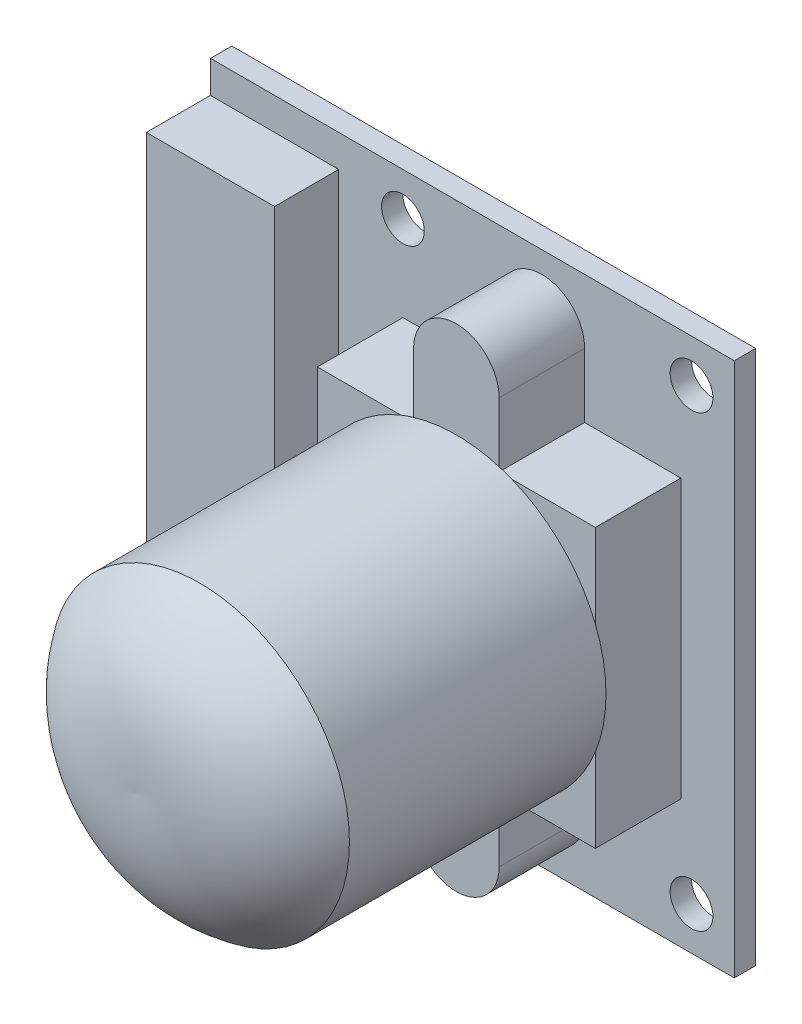
ISO-10303-21;
HEADER;
FILE_DESCRIPTION(('STEP AP214'),'2;1');
FILE_NAME('part.step','',(''),(''),'','','');
FILE_SCHEMA(('AUTOMOTIVE_DESIGN { 1 0 10303 214 1 1 1 1 }'));
ENDSEC;
DATA;
#1=APPLICATION_CONTEXT('core data for automotive mechanical design processes');
#2=APPLICATION_PROTOCOL_DEFINITION('international standard','automotive_design',2000,#1);
#3=PRODUCT_CONTEXT('',#1,'mechanical');
#4=PRODUCT('Part','Part','',(#3));
#5=PRODUCT_RELATED_PRODUCT_CATEGORY('part','',(#4));
#6=PRODUCT_DEFINITION_FORMATION('','',#4);
#7=PRODUCT_DEFINITION_CONTEXT('part definition',#1,'design');
#8=PRODUCT_DEFINITION('design','',#6,#7);
#9=PRODUCT_DEFINITION_SHAPE('','',#8);
#10=(LENGTH_UNIT() NAMED_UNIT(*) SI_UNIT(.MILLI.,.METRE.));
#11=(NAMED_UNIT(*) PLANE_ANGLE_UNIT() SI_UNIT($,.RADIAN.));
#12=(NAMED_UNIT(*) SI_UNIT($,.STERADIAN.) SOLID_ANGLE_UNIT());
#13=UNCERTAINTY_MEASURE_WITH_UNIT(LENGTH_MEASURE(1.E-05),#10,'distance_accuracy_value','');
#14=(GEOMETRIC_REPRESENTATION_CONTEXT(3) GLOBAL_UNCERTAINTY_ASSIGNED_CONTEXT((#13)) GLOBAL_UNIT_ASSIGNED_CONTEXT((#10,
#11,#12)) REPRESENTATION_CONTEXT('',''));
#15=CARTESIAN_POINT('',(0.,0.,0.));
#16=DIRECTION('',(0.,0.,1.));
#17=DIRECTION('',(1.,0.,0.));
#18=AXIS2_PLACEMENT_3D('',#15,#16,#17);
#19=CARTESIAN_POINT('',(0.,0.,5.));
#20=DIRECTION('',(0.,0.,1.));
#21=DIRECTION('',(1.,0.,0.));
#22=AXIS2_PLACEMENT_3D('',#19,#20,#21);
#23=PLANE('',#22);
#24=CARTESIAN_POINT('',(3.25,0.,5.));
#25=DIRECTION('',(0.,0.,1.));
#26=DIRECTION('',(1.,0.,0.));
#27=AXIS2_PLACEMENT_3D('',#24,#25,#26);
#28=CIRCLE('',#27,7.);
#29=CARTESIAN_POINT('',(9.75,2.59807621135332,5.));
#30=VERTEX_POINT('',#29);
#31=CARTESIAN_POINT('',(5.84807621135332,6.5,5.));
#32=VERTEX_POINT('',#31);
#33=EDGE_CURVE('E223',#30,#32,#28,.T.);
#34=ORIENTED_EDGE('',*,*,#33,.F.);
#35=DIRECTION('',(0.,-1.,0.));
#36=VECTOR('',#35,1.);
#37=CARTESIAN_POINT('',(9.75,0.,5.));
#38=LINE('',#37,#36);
#39=CARTESIAN_POINT('',(9.75,6.5,5.));
#40=VERTEX_POINT('',#39);
#41=EDGE_CURVE('E270',#40,#30,#38,.T.);
#42=ORIENTED_EDGE('',*,*,#41,.F.);
#43=DIRECTION('',(1.,0.,0.));
#44=VECTOR('',#43,1.);
#45=CARTESIAN_POINT('',(0.,6.5,5.));
#46=LINE('',#45,#44);
#47=EDGE_CURVE('E60',#32,#40,#46,.T.);
#48=ORIENTED_EDGE('',*,*,#47,.F.);
#49=EDGE_LOOP('',(#34,#42,#48));
#50=FACE_BOUND('',#49,.T.);
#51=ADVANCED_FACE('F36',(#50),#23,.T.);
#52=CARTESIAN_POINT('',(5.25000000000001,6.70820393249937,5.));
#53=VERTEX_POINT('',#52);
#54=CARTESIAN_POINT('',(1.25000000000001,6.70820393249937,5.));
#55=VERTEX_POINT('',#54);
#56=EDGE_CURVE('E11',#53,#55,#28,.T.);
#57=ORIENTED_EDGE('',*,*,#56,.F.);
#58=DIRECTION('',(0.,-1.,0.));
#59=VECTOR('',#58,1.);
#60=CARTESIAN_POINT('',(5.25000000000001,0.,5.));
#61=LINE('',#60,#59);
#62=CARTESIAN_POINT('',(5.25000000000001,9.5,5.));
#63=VERTEX_POINT('',#62);
#64=EDGE_CURVE('E275',#63,#53,#61,.T.);
#65=ORIENTED_EDGE('',*,*,#64,.F.);
#66=CARTESIAN_POINT('',(3.25000000000001,9.5,5.));
#67=DIRECTION('',(0.,0.,1.));
#68=DIRECTION('',(1.,0.,0.));
#69=AXIS2_PLACEMENT_3D('',#66,#67,#68);
#70=CIRCLE('',#69,2.);
#71=CARTESIAN_POINT('',(1.25000000000001,9.5,5.));
#72=VERTEX_POINT('',#71);
#73=EDGE_CURVE('E236',#63,#72,#70,.T.);
#74=ORIENTED_EDGE('',*,*,#73,.T.);
#75=DIRECTION('',(0.,-1.,0.));
#76=VECTOR('',#75,1.);
#77=CARTESIAN_POINT('',(1.25000000000001,0.,5.));
#78=LINE('',#77,#76);
#79=EDGE_CURVE('E241',#72,#55,#78,.T.);
#80=ORIENTED_EDGE('',*,*,#79,.T.);
#81=EDGE_LOOP('',(#57,#65,#74,#80));
#82=FACE_BOUND('',#81,.T.);
#83=ADVANCED_FACE('F518',(#82),#23,.T.);
#84=CARTESIAN_POINT('',(0.651923788646684,6.5,5.));
#85=VERTEX_POINT('',#84);
#86=CARTESIAN_POINT('',(-3.25,2.59807621135331,5.));
#87=VERTEX_POINT('',#86);
#88=EDGE_CURVE('E45',#85,#87,#28,.T.);
#89=ORIENTED_EDGE('',*,*,#88,.F.);
#90=CARTESIAN_POINT('',(-3.25,6.5,5.));
#91=VERTEX_POINT('',#90);
#92=EDGE_CURVE('E244',#91,#85,#46,.T.);
#93=ORIENTED_EDGE('',*,*,#92,.F.);
#94=DIRECTION('',(0.,-1.,0.));
#95=VECTOR('',#94,1.);
#96=CARTESIAN_POINT('',(-3.25,0.,5.));
#97=LINE('',#96,#95);
#98=EDGE_CURVE('E249',#91,#87,#97,.T.);
#99=ORIENTED_EDGE('',*,*,#98,.T.);
#100=EDGE_LOOP('',(#89,#93,#99));
#101=FACE_BOUND('',#100,.T.);
#102=ADVANCED_FACE('F436',(#101),#23,.T.);
#103=CARTESIAN_POINT('',(-3.25,-2.59807621135332,5.));
#104=VERTEX_POINT('',#103);
#105=CARTESIAN_POINT('',(0.651923788646683,-6.5,5.));
#106=VERTEX_POINT('',#105);
#107=EDGE_CURVE('E423',#104,#106,#28,.T.);
#108=ORIENTED_EDGE('',*,*,#107,.F.);
#109=CARTESIAN_POINT('',(-3.25,-6.5,5.));
#110=VERTEX_POINT('',#109);
#111=EDGE_CURVE('E247',#104,#110,#97,.T.);
#112=ORIENTED_EDGE('',*,*,#111,.T.);
#113=DIRECTION('',(1.,0.,0.));
#114=VECTOR('',#113,1.);
#115=CARTESIAN_POINT('',(0.,-6.5,5.));
#116=LINE('',#115,#114);
#117=EDGE_CURVE('E254',#110,#106,#116,.T.);
#118=ORIENTED_EDGE('',*,*,#117,.T.);
#119=EDGE_LOOP('',(#108,#112,#118));
#120=FACE_BOUND('',#119,.T.);
#121=ADVANCED_FACE('F533',(#120),#23,.T.);
#122=CARTESIAN_POINT('',(1.25000000000001,-6.70820393249937,5.));
#123=VERTEX_POINT('',#122);
#124=CARTESIAN_POINT('',(5.25000000000001,-6.70820393249937,5.));
#125=VERTEX_POINT('',#124);
#126=EDGE_CURVE('E418',#123,#125,#28,.T.);
#127=ORIENTED_EDGE('',*,*,#126,.F.);
#128=DIRECTION('',(0.,1.,0.));
#129=VECTOR('',#128,1.);
#130=CARTESIAN_POINT('',(1.25000000000001,0.,5.));
#131=LINE('',#130,#129);
#132=CARTESIAN_POINT('',(1.25000000000001,-9.5,5.));
#133=VERTEX_POINT('',#132);
#134=EDGE_CURVE('E260',#133,#123,#131,.T.);
#135=ORIENTED_EDGE('',*,*,#134,.F.);
#136=CARTESIAN_POINT('',(3.25000000000001,-9.5,5.));
#137=DIRECTION('',(0.,0.,1.));
#138=DIRECTION('',(1.,0.,0.));
#139=AXIS2_PLACEMENT_3D('',#136,#137,#138);
#140=CIRCLE('',#139,2.);
#141=CARTESIAN_POINT('',(5.25000000000001,-9.49999999999999,5.));
#142=VERTEX_POINT('',#141);
#143=EDGE_CURVE('E263',#142,#133,#140,.F.);
#144=ORIENTED_EDGE('',*,*,#143,.F.);
#145=DIRECTION('',(0.,1.,0.));
#146=VECTOR('',#145,1.);
#147=CARTESIAN_POINT('',(5.25000000000001,0.,5.));
#148=LINE('',#147,#146);
#149=EDGE_CURVE('E267',#142,#125,#148,.T.);
#150=ORIENTED_EDGE('',*,*,#149,.T.);
#151=EDGE_LOOP('',(#127,#135,#144,#150));
#152=FACE_BOUND('',#151,.T.);
#153=ADVANCED_FACE('F487',(#152),#23,.T.);
#154=CARTESIAN_POINT('',(0.,0.,1.));
#155=DIRECTION('',(0.,0.,-1.));
#156=DIRECTION('',(-1.,0.,0.));
#157=AXIS2_PLACEMENT_3D('',#154,#155,#156);
#158=PLANE('',#157);
#159=DIRECTION('',(1.,0.,0.));
#160=VECTOR('',#159,1.);
#161=CARTESIAN_POINT('',(0.,-11.,1.));
#162=LINE('',#161,#160);
#163=CARTESIAN_POINT('',(-12.25,-11.,1.));
#164=VERTEX_POINT('',#163);
#165=CARTESIAN_POINT('',(-6.25,-11.,1.));
#166=VERTEX_POINT('',#165);
#167=EDGE_CURVE('E352',#164,#166,#162,.T.);
#168=ORIENTED_EDGE('',*,*,#167,.F.);
#169=DIRECTION('',(0.,-1.,0.));
#170=VECTOR('',#169,1.);
#171=CARTESIAN_POINT('',(-12.25,-12.5,1.));
#172=LINE('',#171,#170);
#173=CARTESIAN_POINT('',(-12.25,-12.5,1.));
#174=VERTEX_POINT('',#173);
#175=EDGE_CURVE('E391',#164,#174,#172,.T.);
#176=ORIENTED_EDGE('',*,*,#175,.T.);
#177=DIRECTION('',(1.,0.,0.));
#178=VECTOR('',#177,1.);
#179=CARTESIAN_POINT('',(-12.25,-12.5,1.));
#180=LINE('',#179,#178);
#181=CARTESIAN_POINT('',(12.25,-12.5,1.));
#182=VERTEX_POINT('',#181);
#183=EDGE_CURVE('E394',#174,#182,#180,.T.);
#184=ORIENTED_EDGE('',*,*,#183,.T.);
#185=DIRECTION('',(0.,1.,0.));
#186=VECTOR('',#185,1.);
#187=CARTESIAN_POINT('',(12.25,-12.5,1.));
#188=LINE('',#187,#186);
#189=CARTESIAN_POINT('',(12.25,12.5,1.));
#190=VERTEX_POINT('',#189);
#191=EDGE_CURVE('E385',#182,#190,#188,.T.);
#192=ORIENTED_EDGE('',*,*,#191,.T.);
#193=DIRECTION('',(-1.,0.,0.));
#194=VECTOR('',#193,1.);
#195=CARTESIAN_POINT('',(-12.25,12.5,1.));
#196=LINE('',#195,#194);
#197=CARTESIAN_POINT('',(-12.25,12.5,1.));
#198=VERTEX_POINT('',#197);
#199=EDGE_CURVE('E388',#190,#198,#196,.T.);
#200=ORIENTED_EDGE('',*,*,#199,.T.);
#201=CARTESIAN_POINT('',(-12.25,11.,1.));
#202=VERTEX_POINT('',#201);
#203=EDGE_CURVE('E392',#198,#202,#172,.T.);
#204=ORIENTED_EDGE('',*,*,#203,.T.);
#205=DIRECTION('',(1.,0.,0.));
#206=VECTOR('',#205,1.);
#207=CARTESIAN_POINT('',(0.,11.,1.));
#208=LINE('',#207,#206);
#209=CARTESIAN_POINT('',(-6.25,11.,1.));
#210=VERTEX_POINT('',#209);
#211=EDGE_CURVE('E359',#202,#210,#208,.T.);
#212=ORIENTED_EDGE('',*,*,#211,.T.);
#213=DIRECTION('',(0.,1.,0.));
#214=VECTOR('',#213,1.);
#215=CARTESIAN_POINT('',(-6.25,0.,1.));
#216=LINE('',#215,#214);
#217=EDGE_CURVE('E369',#166,#210,#216,.T.);
#218=ORIENTED_EDGE('',*,*,#217,.F.);
#219=EDGE_LOOP('',(#168,#176,#184,#192,#200,#204,#212,#218));
#220=FACE_BOUND('',#219,.T.);
#221=CARTESIAN_POINT('',(10.25,10.5,1.));
#222=DIRECTION('',(0.,0.,1.));
#223=DIRECTION('',(1.,0.,0.));
#224=AXIS2_PLACEMENT_3D('',#221,#222,#223);
#225=CIRCLE('',#224,1.);
#226=CARTESIAN_POINT('',(11.25,10.5,1.));
#227=VERTEX_POINT('',#226);
#228=EDGE_CURVE('E334',#227,#227,#225,.T.);
#229=ORIENTED_EDGE('',*,*,#228,.F.);
#230=EDGE_LOOP('',(#229));
#231=FACE_BOUND('',#230,.T.);
#232=CARTESIAN_POINT('',(10.25,-10.5,1.));
#233=DIRECTION('',(0.,0.,1.));
#234=DIRECTION('',(1.,0.,0.));
#235=AXIS2_PLACEMENT_3D('',#232,#233,#234);
#236=CIRCLE('',#235,1.);
#237=CARTESIAN_POINT('',(11.25,-10.5,1.));
#238=VERTEX_POINT('',#237);
#239=EDGE_CURVE('E335',#238,#238,#236,.T.);
#240=ORIENTED_EDGE('',*,*,#239,.F.);
#241=EDGE_LOOP('',(#240));
#242=FACE_BOUND('',#241,.T.);
#243=CARTESIAN_POINT('',(-3.25,-10.5,1.));
#244=DIRECTION('',(0.,0.,1.));
#245=DIRECTION('',(1.,0.,0.));
#246=AXIS2_PLACEMENT_3D('',#243,#244,#245);
#247=CIRCLE('',#246,1.);
#248=CARTESIAN_POINT('',(-2.25,-10.5,1.));
#249=VERTEX_POINT('',#248);
#250=EDGE_CURVE('E341',#249,#249,#247,.T.);
#251=ORIENTED_EDGE('',*,*,#250,.F.);
#252=EDGE_LOOP('',(#251));
#253=FACE_BOUND('',#252,.T.);
#254=CARTESIAN_POINT('',(-3.25,10.5,1.));
#255=DIRECTION('',(0.,0.,1.));
#256=DIRECTION('',(1.,0.,0.));
#257=AXIS2_PLACEMENT_3D('',#254,#255,#256);
#258=CIRCLE('',#257,1.);
#259=CARTESIAN_POINT('',(-2.25,10.5,1.));
#260=VERTEX_POINT('',#259);
#261=EDGE_CURVE('E330',#260,#260,#258,.T.);
#262=ORIENTED_EDGE('',*,*,#261,.F.);
#263=EDGE_LOOP('',(#262));
#264=FACE_BOUND('',#263,.T.);
#265=CARTESIAN_POINT('',(3.25000000000001,9.5,1.));
#266=DIRECTION('',(0.,0.,1.));
#267=DIRECTION('',(1.,0.,0.));
#268=AXIS2_PLACEMENT_3D('',#265,#266,#267);
#269=CIRCLE('',#268,2.);
#270=CARTESIAN_POINT('',(5.25000000000001,9.5,1.));
#271=VERTEX_POINT('',#270);
#272=CARTESIAN_POINT('',(1.25000000000001,9.5,1.));
#273=VERTEX_POINT('',#272);
#274=EDGE_CURVE('E222',#271,#273,#269,.T.);
#275=ORIENTED_EDGE('',*,*,#274,.F.);
#276=DIRECTION('',(0.,-1.,0.));
#277=VECTOR('',#276,1.);
#278=CARTESIAN_POINT('',(5.25000000000001,0.,1.));
#279=LINE('',#278,#277);
#280=CARTESIAN_POINT('',(5.25000000000001,6.5,1.));
#281=VERTEX_POINT('',#280);
#282=EDGE_CURVE('E240',#271,#281,#279,.T.);
#283=ORIENTED_EDGE('',*,*,#282,.T.);
#284=DIRECTION('',(1.,0.,0.));
#285=VECTOR('',#284,1.);
#286=CARTESIAN_POINT('',(0.,6.5,1.));
#287=LINE('',#286,#285);
#288=CARTESIAN_POINT('',(9.75,6.5,1.));
#289=VERTEX_POINT('',#288);
#290=EDGE_CURVE('E285',#281,#289,#287,.T.);
#291=ORIENTED_EDGE('',*,*,#290,.T.);
#292=DIRECTION('',(0.,-1.,0.));
#293=VECTOR('',#292,1.);
#294=CARTESIAN_POINT('',(9.75,0.,1.));
#295=LINE('',#294,#293);
#296=CARTESIAN_POINT('',(9.75,-6.5,1.));
#297=VERTEX_POINT('',#296);
#298=EDGE_CURVE('E299',#289,#297,#295,.T.);
#299=ORIENTED_EDGE('',*,*,#298,.T.);
#300=DIRECTION('',(1.,0.,0.));
#301=VECTOR('',#300,1.);
#302=CARTESIAN_POINT('',(0.,-6.5,1.));
#303=LINE('',#302,#301);
#304=CARTESIAN_POINT('',(5.25000000000001,-6.5,1.));
#305=VERTEX_POINT('',#304);
#306=EDGE_CURVE('E291',#305,#297,#303,.T.);
#307=ORIENTED_EDGE('',*,*,#306,.F.);
#308=DIRECTION('',(0.,1.,0.));
#309=VECTOR('',#308,1.);
#310=CARTESIAN_POINT('',(5.25000000000001,0.,1.));
#311=LINE('',#310,#309);
#312=CARTESIAN_POINT('',(5.25000000000001,-9.49999999999999,1.));
#313=VERTEX_POINT('',#312);
#314=EDGE_CURVE('E297',#313,#305,#311,.T.);
#315=ORIENTED_EDGE('',*,*,#314,.F.);
#316=CARTESIAN_POINT('',(3.25000000000001,-9.5,1.));
#317=DIRECTION('',(0.,0.,1.));
#318=DIRECTION('',(1.,0.,0.));
#319=AXIS2_PLACEMENT_3D('',#316,#317,#318);
#320=CIRCLE('',#319,2.);
#321=CARTESIAN_POINT('',(1.25000000000001,-9.5,1.));
#322=VERTEX_POINT('',#321);
#323=EDGE_CURVE('E294',#313,#322,#320,.F.);
#324=ORIENTED_EDGE('',*,*,#323,.T.);
#325=DIRECTION('',(0.,1.,0.));
#326=VECTOR('',#325,1.);
#327=CARTESIAN_POINT('',(1.25000000000001,0.,1.));
#328=LINE('',#327,#326);
#329=CARTESIAN_POINT('',(1.25000000000001,-6.5,1.));
#330=VERTEX_POINT('',#329);
#331=EDGE_CURVE('E290',#322,#330,#328,.T.);
#332=ORIENTED_EDGE('',*,*,#331,.T.);
#333=CARTESIAN_POINT('',(-3.25,-6.5,1.));
#334=VERTEX_POINT('',#333);
#335=EDGE_CURVE('E287',#334,#330,#303,.T.);
#336=ORIENTED_EDGE('',*,*,#335,.F.);
#337=DIRECTION('',(0.,-1.,0.));
#338=VECTOR('',#337,1.);
#339=CARTESIAN_POINT('',(-3.25,0.,1.));
#340=LINE('',#339,#338);
#341=CARTESIAN_POINT('',(-3.25,6.5,1.));
#342=VERTEX_POINT('',#341);
#343=EDGE_CURVE('E284',#342,#334,#340,.T.);
#344=ORIENTED_EDGE('',*,*,#343,.F.);
#345=CARTESIAN_POINT('',(1.25000000000001,6.5,1.));
#346=VERTEX_POINT('',#345);
#347=EDGE_CURVE('E281',#342,#346,#287,.T.);
#348=ORIENTED_EDGE('',*,*,#347,.T.);
#349=DIRECTION('',(0.,-1.,0.));
#350=VECTOR('',#349,1.);
#351=CARTESIAN_POINT('',(1.25000000000001,0.,1.));
#352=LINE('',#351,#350);
#353=EDGE_CURVE('E226',#273,#346,#352,.T.);
#354=ORIENTED_EDGE('',*,*,#353,.F.);
#355=EDGE_LOOP('',(#275,#283,#291,#299,#307,#315,#324,#332,#336,#344,#348,#354));
#356=FACE_BOUND('',#355,.T.);
#357=ADVANCED_FACE('F481',(#220,#231,#242,#253,#264,#356),#158,.F.);
#358=CARTESIAN_POINT('',(12.25,-12.5,1.));
#359=DIRECTION('',(-1.,0.,0.));
#360=DIRECTION('',(0.,0.,1.));
#361=AXIS2_PLACEMENT_3D('',#358,#359,#360);
#362=PLANE('',#361);
#363=DIRECTION('',(0.,1.,0.));
#364=VECTOR('',#363,1.);
#365=CARTESIAN_POINT('',(12.25,-12.5,0.));
#366=LINE('',#365,#364);
#367=CARTESIAN_POINT('',(12.25,-12.5,0.));
#368=VERTEX_POINT('',#367);
#369=CARTESIAN_POINT('',(12.25,12.5,0.));
#370=VERTEX_POINT('',#369);
#371=EDGE_CURVE('E384',#368,#370,#366,.T.);
#372=ORIENTED_EDGE('',*,*,#371,.T.);
#373=DIRECTION('',(0.,0.,-1.));
#374=VECTOR('',#373,1.);
#375=CARTESIAN_POINT('',(12.25,12.5,1.));
#376=LINE('',#375,#374);
#377=EDGE_CURVE('E40',#190,#370,#376,.T.);
#378=ORIENTED_EDGE('',*,*,#377,.F.);
#379=ORIENTED_EDGE('',*,*,#191,.F.);
#380=DIRECTION('',(0.,0.,-1.));
#381=VECTOR('',#380,1.);
#382=CARTESIAN_POINT('',(12.25,-12.5,1.));
#383=LINE('',#382,#381);
#384=EDGE_CURVE('E396',#182,#368,#383,.T.);
#385=ORIENTED_EDGE('',*,*,#384,.T.);
#386=EDGE_LOOP('',(#372,#378,#379,#385));
#387=FACE_BOUND('',#386,.T.);
#388=ADVANCED_FACE('F38',(#387),#362,.F.);
#389=CARTESIAN_POINT('',(-12.25,12.5,1.));
#390=DIRECTION('',(0.,-1.,0.));
#391=DIRECTION('',(0.,0.,-1.));
#392=AXIS2_PLACEMENT_3D('',#389,#390,#391);
#393=PLANE('',#392);
#394=DIRECTION('',(-1.,0.,0.));
#395=VECTOR('',#394,1.);
#396=CARTESIAN_POINT('',(-12.25,12.5,0.));
#397=LINE('',#396,#395);
#398=CARTESIAN_POINT('',(-12.25,12.5,0.));
#399=VERTEX_POINT('',#398);
#400=EDGE_CURVE('E399',#370,#399,#397,.T.);
#401=ORIENTED_EDGE('',*,*,#400,.T.);
#402=DIRECTION('',(0.,0.,-1.));
#403=VECTOR('',#402,1.);
#404=CARTESIAN_POINT('',(-12.25,12.5,1.));
#405=LINE('',#404,#403);
#406=EDGE_CURVE('E408',#198,#399,#405,.T.);
#407=ORIENTED_EDGE('',*,*,#406,.F.);
#408=ORIENTED_EDGE('',*,*,#199,.F.);
#409=ORIENTED_EDGE('',*,*,#377,.T.);
#410=EDGE_LOOP('',(#401,#407,#408,#409));
#411=FACE_BOUND('',#410,.T.);
#412=ADVANCED_FACE('F795',(#411),#393,.F.);
#413=CARTESIAN_POINT('',(-12.25,-12.5,1.));
#414=DIRECTION('',(1.,0.,0.));
#415=DIRECTION('',(0.,0.,-1.));
#416=AXIS2_PLACEMENT_3D('',#413,#414,#415);
#417=PLANE('',#416);
#418=DIRECTION('',(0.,-1.,0.));
#419=VECTOR('',#418,1.);
#420=CARTESIAN_POINT('',(-12.25,-12.5,0.));
#421=LINE('',#420,#419);
#422=CARTESIAN_POINT('',(-12.25,-12.5,0.));
#423=VERTEX_POINT('',#422);
#424=EDGE_CURVE('E401',#399,#423,#421,.T.);
#425=ORIENTED_EDGE('',*,*,#424,.T.);
#426=DIRECTION('',(0.,0.,-1.));
#427=VECTOR('',#426,1.);
#428=CARTESIAN_POINT('',(-12.25,-12.5,1.));
#429=LINE('',#428,#427);
#430=EDGE_CURVE('E406',#174,#423,#429,.T.);
#431=ORIENTED_EDGE('',*,*,#430,.F.);
#432=ORIENTED_EDGE('',*,*,#175,.F.);
#433=DIRECTION('',(0.,0.,-1.));
#434=VECTOR('',#433,1.);
#435=CARTESIAN_POINT('',(-12.25,-11.,4.));
#436=LINE('',#435,#434);
#437=CARTESIAN_POINT('',(-12.25,-11.,4.));
#438=VERTEX_POINT('',#437);
#439=EDGE_CURVE('E366',#438,#164,#436,.T.);
#440=ORIENTED_EDGE('',*,*,#439,.F.);
#441=DIRECTION('',(0.,-1.,0.));
#442=VECTOR('',#441,1.);
#443=CARTESIAN_POINT('',(-12.25,0.,4.));
#444=LINE('',#443,#442);
#445=CARTESIAN_POINT('',(-12.25,11.,4.));
#446=VERTEX_POINT('',#445);
#447=EDGE_CURVE('E364',#446,#438,#444,.T.);
#448=ORIENTED_EDGE('',*,*,#447,.F.);
#449=DIRECTION('',(0.,0.,-1.));
#450=VECTOR('',#449,1.);
#451=CARTESIAN_POINT('',(-12.25,11.,4.));
#452=LINE('',#451,#450);
#453=EDGE_CURVE('E375',#446,#202,#452,.T.);
#454=ORIENTED_EDGE('',*,*,#453,.T.);
#455=ORIENTED_EDGE('',*,*,#203,.F.);
#456=ORIENTED_EDGE('',*,*,#406,.T.);
#457=EDGE_LOOP('',(#425,#431,#432,#440,#448,#454,#455,#456));
#458=FACE_BOUND('',#457,.T.);
#459=ADVANCED_FACE('F792',(#458),#417,.F.);
#460=CARTESIAN_POINT('',(-12.25,-12.5,1.));
#461=DIRECTION('',(0.,1.,0.));
#462=DIRECTION('',(0.,0.,1.));
#463=AXIS2_PLACEMENT_3D('',#460,#461,#462);
#464=PLANE('',#463);
#465=DIRECTION('',(1.,0.,0.));
#466=VECTOR('',#465,1.);
#467=CARTESIAN_POINT('',(-12.25,-12.5,0.));
#468=LINE('',#467,#466);
#469=EDGE_CURVE('E389',#423,#368,#468,.T.);
#470=ORIENTED_EDGE('',*,*,#469,.T.);
#471=ORIENTED_EDGE('',*,*,#384,.F.);
#472=ORIENTED_EDGE('',*,*,#183,.F.);
#473=ORIENTED_EDGE('',*,*,#430,.T.);
#474=EDGE_LOOP('',(#470,#471,#472,#473));
#475=FACE_BOUND('',#474,.T.);
#476=ADVANCED_FACE('F788',(#475),#464,.F.);
#477=CARTESIAN_POINT('',(0.,0.,0.));
#478=DIRECTION('',(0.,0.,-1.));
#479=DIRECTION('',(-1.,0.,0.));
#480=AXIS2_PLACEMENT_3D('',#477,#478,#479);
#481=PLANE('',#480);
#482=CARTESIAN_POINT('',(-3.25,10.5,0.));
#483=DIRECTION('',(0.,0.,1.));
#484=DIRECTION('',(1.,0.,0.));
#485=AXIS2_PLACEMENT_3D('',#482,#483,#484);
#486=CIRCLE('',#485,1.);
#487=CARTESIAN_POINT('',(-2.25,10.5,0.));
#488=VERTEX_POINT('',#487);
#489=EDGE_CURVE('E344',#488,#488,#486,.T.);
#490=ORIENTED_EDGE('',*,*,#489,.T.);
#491=EDGE_LOOP('',(#490));
#492=FACE_BOUND('',#491,.T.);
#493=CARTESIAN_POINT('',(-3.25,-10.5,0.));
#494=DIRECTION('',(0.,0.,1.));
#495=DIRECTION('',(1.,0.,0.));
#496=AXIS2_PLACEMENT_3D('',#493,#494,#495);
#497=CIRCLE('',#496,1.);
#498=CARTESIAN_POINT('',(-2.25,-10.5,0.));
#499=VERTEX_POINT('',#498);
#500=EDGE_CURVE('E338',#499,#499,#497,.T.);
#501=ORIENTED_EDGE('',*,*,#500,.T.);
#502=EDGE_LOOP('',(#501));
#503=FACE_BOUND('',#502,.T.);
#504=CARTESIAN_POINT('',(10.25,-10.5,0.));
#505=DIRECTION('',(0.,0.,1.));
#506=DIRECTION('',(1.,0.,0.));
#507=AXIS2_PLACEMENT_3D('',#504,#505,#506);
#508=CIRCLE('',#507,1.);
#509=CARTESIAN_POINT('',(11.25,-10.5,0.));
#510=VERTEX_POINT('',#509);
#511=EDGE_CURVE('E331',#510,#510,#508,.T.);
#512=ORIENTED_EDGE('',*,*,#511,.T.);
#513=EDGE_LOOP('',(#512));
#514=FACE_BOUND('',#513,.T.);
#515=CARTESIAN_POINT('',(10.25,10.5,0.));
#516=DIRECTION('',(0.,0.,1.));
#517=DIRECTION('',(1.,0.,0.));
#518=AXIS2_PLACEMENT_3D('',#515,#516,#517);
#519=CIRCLE('',#518,1.);
#520=CARTESIAN_POINT('',(11.25,10.5,0.));
#521=VERTEX_POINT('',#520);
#522=EDGE_CURVE('E349',#521,#521,#519,.T.);
#523=ORIENTED_EDGE('',*,*,#522,.T.);
#524=EDGE_LOOP('',(#523));
#525=FACE_BOUND('',#524,.T.);
#526=ORIENTED_EDGE('',*,*,#371,.F.);
#527=ORIENTED_EDGE('',*,*,#469,.F.);
#528=ORIENTED_EDGE('',*,*,#424,.F.);
#529=ORIENTED_EDGE('',*,*,#400,.F.);
#530=EDGE_LOOP('',(#526,#527,#528,#529));
#531=FACE_BOUND('',#530,.T.);
#532=ADVANCED_FACE('F783',(#492,#503,#514,#525,#531),#481,.T.);
#533=CARTESIAN_POINT('',(0.,-11.,4.));
#534=DIRECTION('',(0.,1.,0.));
#535=DIRECTION('',(0.,0.,1.));
#536=AXIS2_PLACEMENT_3D('',#533,#534,#535);
#537=PLANE('',#536);
#538=ORIENTED_EDGE('',*,*,#167,.T.);
#539=DIRECTION('',(0.,0.,-1.));
#540=VECTOR('',#539,1.);
#541=CARTESIAN_POINT('',(-6.25,-11.,4.));
#542=LINE('',#541,#540);
#543=CARTESIAN_POINT('',(-6.25,-11.,4.));
#544=VERTEX_POINT('',#543);
#545=EDGE_CURVE('E381',#544,#166,#542,.T.);
#546=ORIENTED_EDGE('',*,*,#545,.F.);
#547=DIRECTION('',(1.,0.,0.));
#548=VECTOR('',#547,1.);
#549=CARTESIAN_POINT('',(0.,-11.,4.));
#550=LINE('',#549,#548);
#551=EDGE_CURVE('E355',#438,#544,#550,.T.);
#552=ORIENTED_EDGE('',*,*,#551,.F.);
#553=ORIENTED_EDGE('',*,*,#439,.T.);
#554=EDGE_LOOP('',(#538,#546,#552,#553));
#555=FACE_BOUND('',#554,.T.);
#556=ADVANCED_FACE('F780',(#555),#537,.F.);
#557=CARTESIAN_POINT('',(-6.25,0.,4.));
#558=DIRECTION('',(-1.,0.,0.));
#559=DIRECTION('',(0.,0.,1.));
#560=AXIS2_PLACEMENT_3D('',#557,#558,#559);
#561=PLANE('',#560);
#562=ORIENTED_EDGE('',*,*,#217,.T.);
#563=DIRECTION('',(0.,0.,-1.));
#564=VECTOR('',#563,1.);
#565=CARTESIAN_POINT('',(-6.25,11.,4.));
#566=LINE('',#565,#564);
#567=CARTESIAN_POINT('',(-6.25,11.,4.));
#568=VERTEX_POINT('',#567);
#569=EDGE_CURVE('E378',#568,#210,#566,.T.);
#570=ORIENTED_EDGE('',*,*,#569,.F.);
#571=DIRECTION('',(0.,1.,0.));
#572=VECTOR('',#571,1.);
#573=CARTESIAN_POINT('',(-6.25,0.,4.));
#574=LINE('',#573,#572);
#575=EDGE_CURVE('E358',#544,#568,#574,.T.);
#576=ORIENTED_EDGE('',*,*,#575,.F.);
#577=ORIENTED_EDGE('',*,*,#545,.T.);
#578=EDGE_LOOP('',(#562,#570,#576,#577));
#579=FACE_BOUND('',#578,.T.);
#580=ADVANCED_FACE('F776',(#579),#561,.F.);
#581=CARTESIAN_POINT('',(0.,11.,4.));
#582=DIRECTION('',(0.,1.,0.));
#583=DIRECTION('',(0.,0.,1.));
#584=AXIS2_PLACEMENT_3D('',#581,#582,#583);
#585=PLANE('',#584);
#586=ORIENTED_EDGE('',*,*,#211,.F.);
#587=ORIENTED_EDGE('',*,*,#453,.F.);
#588=DIRECTION('',(1.,0.,0.));
#589=VECTOR('',#588,1.);
#590=CARTESIAN_POINT('',(0.,11.,4.));
#591=LINE('',#590,#589);
#592=EDGE_CURVE('E361',#446,#568,#591,.T.);
#593=ORIENTED_EDGE('',*,*,#592,.T.);
#594=ORIENTED_EDGE('',*,*,#569,.T.);
#595=EDGE_LOOP('',(#586,#587,#593,#594));
#596=FACE_BOUND('',#595,.T.);
#597=ADVANCED_FACE('F772',(#596),#585,.T.);
#598=CARTESIAN_POINT('',(0.,0.,4.));
#599=DIRECTION('',(0.,0.,1.));
#600=DIRECTION('',(1.,0.,0.));
#601=AXIS2_PLACEMENT_3D('',#598,#599,#600);
#602=PLANE('',#601);
#603=ORIENTED_EDGE('',*,*,#551,.T.);
#604=ORIENTED_EDGE('',*,*,#575,.T.);
#605=ORIENTED_EDGE('',*,*,#592,.F.);
#606=ORIENTED_EDGE('',*,*,#447,.T.);
#607=EDGE_LOOP('',(#603,#604,#605,#606));
#608=FACE_BOUND('',#607,.T.);
#609=ADVANCED_FACE('F768',(#608),#602,.T.);
#610=CARTESIAN_POINT('',(10.25,10.5,0.));
#611=DIRECTION('',(0.,0.,1.));
#612=DIRECTION('',(1.,0.,0.));
#613=AXIS2_PLACEMENT_3D('',#610,#611,#612);
#614=CYLINDRICAL_SURFACE('',#613,1.);
#615=ORIENTED_EDGE('',*,*,#522,.F.);
#616=EDGE_LOOP('',(#615));
#617=FACE_BOUND('',#616,.T.);
#618=ORIENTED_EDGE('',*,*,#228,.T.);
#619=EDGE_LOOP('',(#618));
#620=FACE_BOUND('',#619,.T.);
#621=ADVANCED_FACE('F758',(#617,#620),#614,.F.);
#622=CARTESIAN_POINT('',(10.25,-10.5,0.));
#623=DIRECTION('',(0.,0.,1.));
#624=DIRECTION('',(1.,0.,0.));
#625=AXIS2_PLACEMENT_3D('',#622,#623,#624);
#626=CYLINDRICAL_SURFACE('',#625,1.);
#627=ORIENTED_EDGE('',*,*,#511,.F.);
#628=EDGE_LOOP('',(#627));
#629=FACE_BOUND('',#628,.T.);
#630=ORIENTED_EDGE('',*,*,#239,.T.);
#631=EDGE_LOOP('',(#630));
#632=FACE_BOUND('',#631,.T.);
#633=ADVANCED_FACE('F754',(#629,#632),#626,.F.);
#634=CARTESIAN_POINT('',(-3.25,-10.5,0.));
#635=DIRECTION('',(0.,0.,1.));
#636=DIRECTION('',(1.,0.,0.));
#637=AXIS2_PLACEMENT_3D('',#634,#635,#636);
#638=CYLINDRICAL_SURFACE('',#637,1.);
#639=ORIENTED_EDGE('',*,*,#500,.F.);
#640=EDGE_LOOP('',(#639));
#641=FACE_BOUND('',#640,.T.);
#642=ORIENTED_EDGE('',*,*,#250,.T.);
#643=EDGE_LOOP('',(#642));
#644=FACE_BOUND('',#643,.T.);
#645=ADVANCED_FACE('F757',(#641,#644),#638,.F.);
#646=CARTESIAN_POINT('',(-3.25,10.5,0.));
#647=DIRECTION('',(0.,0.,1.));
#648=DIRECTION('',(1.,0.,0.));
#649=AXIS2_PLACEMENT_3D('',#646,#647,#648);
#650=CYLINDRICAL_SURFACE('',#649,1.);
#651=ORIENTED_EDGE('',*,*,#489,.F.);
#652=EDGE_LOOP('',(#651));
#653=FACE_BOUND('',#652,.T.);
#654=ORIENTED_EDGE('',*,*,#261,.T.);
#655=EDGE_LOOP('',(#654));
#656=FACE_BOUND('',#655,.T.);
#657=ADVANCED_FACE('F752',(#653,#656),#650,.F.);
#658=CARTESIAN_POINT('',(3.25000000000001,9.5,5.));
#659=DIRECTION('',(0.,0.,-1.));
#660=DIRECTION('',(-1.,0.,0.));
#661=AXIS2_PLACEMENT_3D('',#658,#659,#660);
#662=CYLINDRICAL_SURFACE('',#661,2.);
#663=ORIENTED_EDGE('',*,*,#274,.T.);
#664=DIRECTION('',(0.,0.,-1.));
#665=VECTOR('',#664,1.);
#666=CARTESIAN_POINT('',(1.25000000000001,9.5,5.));
#667=LINE('',#666,#665);
#668=EDGE_CURVE('E328',#72,#273,#667,.T.);
#669=ORIENTED_EDGE('',*,*,#668,.F.);
#670=ORIENTED_EDGE('',*,*,#73,.F.);
#671=DIRECTION('',(0.,0.,-1.));
#672=VECTOR('',#671,1.);
#673=CARTESIAN_POINT('',(5.25000000000001,9.5,5.));
#674=LINE('',#673,#672);
#675=EDGE_CURVE('E276',#63,#271,#674,.T.);
#676=ORIENTED_EDGE('',*,*,#675,.T.);
#677=EDGE_LOOP('',(#663,#669,#670,#676));
#678=FACE_BOUND('',#677,.T.);
#679=ADVANCED_FACE('F647',(#678),#662,.T.);
#680=CARTESIAN_POINT('',(1.25000000000001,0.,5.));
#681=DIRECTION('',(1.,0.,0.));
#682=DIRECTION('',(0.,0.,-1.));
#683=AXIS2_PLACEMENT_3D('',#680,#681,#682);
#684=PLANE('',#683);
#685=ORIENTED_EDGE('',*,*,#353,.T.);
#686=DIRECTION('',(0.,0.,-1.));
#687=VECTOR('',#686,1.);
#688=CARTESIAN_POINT('',(1.25000000000001,6.5,5.));
#689=LINE('',#688,#687);
#690=CARTESIAN_POINT('',(1.25000000000001,6.5,5.));
#691=VERTEX_POINT('',#690);
#692=EDGE_CURVE('E326',#691,#346,#689,.T.);
#693=ORIENTED_EDGE('',*,*,#692,.F.);
#694=EDGE_CURVE('E239',#55,#691,#78,.T.);
#695=ORIENTED_EDGE('',*,*,#694,.F.);
#696=ORIENTED_EDGE('',*,*,#79,.F.);
#697=ORIENTED_EDGE('',*,*,#668,.T.);
#698=EDGE_LOOP('',(#685,#693,#695,#696,#697));
#699=FACE_BOUND('',#698,.T.);
#700=ADVANCED_FACE('F642',(#699),#684,.F.);
#701=CARTESIAN_POINT('',(0.,6.5,5.));
#702=DIRECTION('',(0.,1.,0.));
#703=DIRECTION('',(-1.,0.,0.));
#704=AXIS2_PLACEMENT_3D('',#701,#702,#703);
#705=PLANE('',#704);
#706=ORIENTED_EDGE('',*,*,#347,.F.);
#707=DIRECTION('',(0.,0.,-1.));
#708=VECTOR('',#707,1.);
#709=CARTESIAN_POINT('',(-3.25,6.5,5.));
#710=LINE('',#709,#708);
#711=EDGE_CURVE('E324',#91,#342,#710,.T.);
#712=ORIENTED_EDGE('',*,*,#711,.F.);
#713=ORIENTED_EDGE('',*,*,#92,.T.);
#714=EDGE_CURVE('E243',#85,#691,#46,.T.);
#715=ORIENTED_EDGE('',*,*,#714,.T.);
#716=ORIENTED_EDGE('',*,*,#692,.T.);
#717=EDGE_LOOP('',(#706,#712,#713,#715,#716));
#718=FACE_BOUND('',#717,.T.);
#719=ADVANCED_FACE('F441',(#718),#705,.T.);
#720=CARTESIAN_POINT('',(-3.25,0.,5.));
#721=DIRECTION('',(1.,0.,0.));
#722=DIRECTION('',(0.,1.,0.));
#723=AXIS2_PLACEMENT_3D('',#720,#721,#722);
#724=PLANE('',#723);
#725=ORIENTED_EDGE('',*,*,#343,.T.);
#726=DIRECTION('',(0.,0.,-1.));
#727=VECTOR('',#726,1.);
#728=CARTESIAN_POINT('',(-3.25,-6.5,5.));
#729=LINE('',#728,#727);
#730=EDGE_CURVE('E321',#110,#334,#729,.T.);
#731=ORIENTED_EDGE('',*,*,#730,.F.);
#732=ORIENTED_EDGE('',*,*,#111,.F.);
#733=EDGE_CURVE('E253',#87,#104,#97,.T.);
#734=ORIENTED_EDGE('',*,*,#733,.F.);
#735=ORIENTED_EDGE('',*,*,#98,.F.);
#736=ORIENTED_EDGE('',*,*,#711,.T.);
#737=EDGE_LOOP('',(#725,#731,#732,#734,#735,#736));
#738=FACE_BOUND('',#737,.T.);
#739=ADVANCED_FACE('F547',(#738),#724,.F.);
#740=CARTESIAN_POINT('',(0.,-6.5,5.));
#741=DIRECTION('',(0.,1.,0.));
#742=DIRECTION('',(0.,0.,1.));
#743=AXIS2_PLACEMENT_3D('',#740,#741,#742);
#744=PLANE('',#743);
#745=ORIENTED_EDGE('',*,*,#335,.T.);
#746=DIRECTION('',(0.,0.,-1.));
#747=VECTOR('',#746,1.);
#748=CARTESIAN_POINT('',(1.25000000000001,-6.5,5.));
#749=LINE('',#748,#747);
#750=CARTESIAN_POINT('',(1.25000000000001,-6.5,5.));
#751=VERTEX_POINT('',#750);
#752=EDGE_CURVE('E319',#751,#330,#749,.T.);
#753=ORIENTED_EDGE('',*,*,#752,.F.);
#754=EDGE_CURVE('E252',#106,#751,#116,.T.);
#755=ORIENTED_EDGE('',*,*,#754,.F.);
#756=ORIENTED_EDGE('',*,*,#117,.F.);
#757=ORIENTED_EDGE('',*,*,#730,.T.);
#758=EDGE_LOOP('',(#745,#753,#755,#756,#757));
#759=FACE_BOUND('',#758,.T.);
#760=ADVANCED_FACE('F474',(#759),#744,.F.);
#761=CARTESIAN_POINT('',(1.25000000000001,0.,5.));
#762=DIRECTION('',(-1.,0.,0.));
#763=DIRECTION('',(0.,-1.,0.));
#764=AXIS2_PLACEMENT_3D('',#761,#762,#763);
#765=PLANE('',#764);
#766=ORIENTED_EDGE('',*,*,#331,.F.);
#767=DIRECTION('',(0.,0.,-1.));
#768=VECTOR('',#767,1.);
#769=CARTESIAN_POINT('',(1.25000000000001,-9.5,5.));
#770=LINE('',#769,#768);
#771=EDGE_CURVE('E317',#133,#322,#770,.T.);
#772=ORIENTED_EDGE('',*,*,#771,.F.);
#773=ORIENTED_EDGE('',*,*,#134,.T.);
#774=EDGE_CURVE('E257',#123,#751,#131,.T.);
#775=ORIENTED_EDGE('',*,*,#774,.T.);
#776=ORIENTED_EDGE('',*,*,#752,.T.);
#777=EDGE_LOOP('',(#766,#772,#773,#775,#776));
#778=FACE_BOUND('',#777,.T.);
#779=ADVANCED_FACE('F471',(#778),#765,.T.);
#780=CARTESIAN_POINT('',(3.25000000000001,-9.5,5.));
#781=DIRECTION('',(0.,0.,-1.));
#782=DIRECTION('',(-1.,0.,0.));
#783=AXIS2_PLACEMENT_3D('',#780,#781,#782);
#784=CYLINDRICAL_SURFACE('',#783,2.);
#785=ORIENTED_EDGE('',*,*,#323,.F.);
#786=DIRECTION('',(0.,0.,-1.));
#787=VECTOR('',#786,1.);
#788=CARTESIAN_POINT('',(5.25000000000001,-9.49999999999999,5.));
#789=LINE('',#788,#787);
#790=EDGE_CURVE('E315',#142,#313,#789,.T.);
#791=ORIENTED_EDGE('',*,*,#790,.F.);
#792=ORIENTED_EDGE('',*,*,#143,.T.);
#793=ORIENTED_EDGE('',*,*,#771,.T.);
#794=EDGE_LOOP('',(#785,#791,#792,#793));
#795=FACE_BOUND('',#794,.T.);
#796=ADVANCED_FACE('F488',(#795),#784,.T.);
#797=CARTESIAN_POINT('',(5.25000000000001,0.,5.));
#798=DIRECTION('',(-1.,0.,0.));
#799=DIRECTION('',(0.,-1.,0.));
#800=AXIS2_PLACEMENT_3D('',#797,#798,#799);
#801=PLANE('',#800);
#802=ORIENTED_EDGE('',*,*,#314,.T.);
#803=DIRECTION('',(0.,0.,-1.));
#804=VECTOR('',#803,1.);
#805=CARTESIAN_POINT('',(5.25000000000001,-6.5,5.));
#806=LINE('',#805,#804);
#807=CARTESIAN_POINT('',(5.25000000000001,-6.5,5.));
#808=VERTEX_POINT('',#807);
#809=EDGE_CURVE('E312',#808,#305,#806,.T.);
#810=ORIENTED_EDGE('',*,*,#809,.F.);
#811=EDGE_CURVE('E266',#125,#808,#148,.T.);
#812=ORIENTED_EDGE('',*,*,#811,.F.);
#813=ORIENTED_EDGE('',*,*,#149,.F.);
#814=ORIENTED_EDGE('',*,*,#790,.T.);
#815=EDGE_LOOP('',(#802,#810,#812,#813,#814));
#816=FACE_BOUND('',#815,.T.);
#817=ADVANCED_FACE('F491',(#816),#801,.F.);
#818=ORIENTED_EDGE('',*,*,#306,.T.);
#819=DIRECTION('',(0.,0.,-1.));
#820=VECTOR('',#819,1.);
#821=CARTESIAN_POINT('',(9.75,-6.5,5.));
#822=LINE('',#821,#820);
#823=CARTESIAN_POINT('',(9.75,-6.5,5.));
#824=VERTEX_POINT('',#823);
#825=EDGE_CURVE('E310',#824,#297,#822,.T.);
#826=ORIENTED_EDGE('',*,*,#825,.F.);
#827=CARTESIAN_POINT('',(5.84807621135332,-6.5,5.));
#828=VERTEX_POINT('',#827);
#829=EDGE_CURVE('E258',#828,#824,#116,.T.);
#830=ORIENTED_EDGE('',*,*,#829,.F.);
#831=EDGE_CURVE('E259',#808,#828,#116,.T.);
#832=ORIENTED_EDGE('',*,*,#831,.F.);
#833=ORIENTED_EDGE('',*,*,#809,.T.);
#834=EDGE_LOOP('',(#818,#826,#830,#832,#833));
#835=FACE_BOUND('',#834,.T.);
#836=ADVANCED_FACE('F505',(#835),#744,.F.);
#837=CARTESIAN_POINT('',(9.75,0.,5.));
#838=DIRECTION('',(1.,0.,0.));
#839=DIRECTION('',(0.,0.,-1.));
#840=AXIS2_PLACEMENT_3D('',#837,#838,#839);
#841=PLANE('',#840);
#842=ORIENTED_EDGE('',*,*,#298,.F.);
#843=DIRECTION('',(0.,0.,-1.));
#844=VECTOR('',#843,1.);
#845=CARTESIAN_POINT('',(9.75,6.5,5.));
#846=LINE('',#845,#844);
#847=EDGE_CURVE('E308',#40,#289,#846,.T.);
#848=ORIENTED_EDGE('',*,*,#847,.F.);
#849=ORIENTED_EDGE('',*,*,#41,.T.);
#850=CARTESIAN_POINT('',(9.75,-2.59807621135332,5.));
#851=VERTEX_POINT('',#850);
#852=EDGE_CURVE('E273',#30,#851,#38,.T.);
#853=ORIENTED_EDGE('',*,*,#852,.T.);
#854=EDGE_CURVE('E274',#851,#824,#38,.T.);
#855=ORIENTED_EDGE('',*,*,#854,.T.);
#856=ORIENTED_EDGE('',*,*,#825,.T.);
#857=EDGE_LOOP('',(#842,#848,#849,#853,#855,#856));
#858=FACE_BOUND('',#857,.T.);
#859=ADVANCED_FACE('F454',(#858),#841,.T.);
#860=ORIENTED_EDGE('',*,*,#290,.F.);
#861=DIRECTION('',(0.,0.,-1.));
#862=VECTOR('',#861,1.);
#863=CARTESIAN_POINT('',(5.25000000000001,6.5,5.));
#864=LINE('',#863,#862);
#865=CARTESIAN_POINT('',(5.25000000000001,6.5,5.));
#866=VERTEX_POINT('',#865);
#867=EDGE_CURVE('E305',#866,#281,#864,.T.);
#868=ORIENTED_EDGE('',*,*,#867,.F.);
#869=EDGE_CURVE('E248',#866,#32,#46,.T.);
#870=ORIENTED_EDGE('',*,*,#869,.T.);
#871=ORIENTED_EDGE('',*,*,#47,.T.);
#872=ORIENTED_EDGE('',*,*,#847,.T.);
#873=EDGE_LOOP('',(#860,#868,#870,#871,#872));
#874=FACE_BOUND('',#873,.T.);
#875=ADVANCED_FACE('F448',(#874),#705,.T.);
#876=CARTESIAN_POINT('',(5.25000000000001,0.,5.));
#877=DIRECTION('',(1.,0.,0.));
#878=DIRECTION('',(0.,0.,-1.));
#879=AXIS2_PLACEMENT_3D('',#876,#877,#878);
#880=PLANE('',#879);
#881=ORIENTED_EDGE('',*,*,#282,.F.);
#882=ORIENTED_EDGE('',*,*,#675,.F.);
#883=ORIENTED_EDGE('',*,*,#64,.T.);
#884=EDGE_CURVE('E277',#53,#866,#61,.T.);
#885=ORIENTED_EDGE('',*,*,#884,.T.);
#886=ORIENTED_EDGE('',*,*,#867,.T.);
#887=EDGE_LOOP('',(#881,#882,#883,#885,#886));
#888=FACE_BOUND('',#887,.T.);
#889=ADVANCED_FACE('F525',(#888),#880,.T.);
#890=EDGE_CURVE('E230',#828,#851,#28,.T.);
#891=ORIENTED_EDGE('',*,*,#890,.F.);
#892=ORIENTED_EDGE('',*,*,#829,.T.);
#893=ORIENTED_EDGE('',*,*,#854,.F.);
#894=EDGE_LOOP('',(#891,#892,#893));
#895=FACE_BOUND('',#894,.T.);
#896=ADVANCED_FACE('F503',(#895),#23,.T.);
#897=CARTESIAN_POINT('',(3.25,0.,5.));
#898=DIRECTION('',(0.,0.,1.));
#899=DIRECTION('',(1.,0.,0.));
#900=AXIS2_PLACEMENT_3D('',#897,#898,#899);
#901=PLANE('',#900);
#902=EDGE_CURVE('E433',#55,#85,#28,.T.);
#903=ORIENTED_EDGE('',*,*,#902,.F.);
#904=ORIENTED_EDGE('',*,*,#694,.T.);
#905=ORIENTED_EDGE('',*,*,#714,.F.);
#906=EDGE_LOOP('',(#903,#904,#905));
#907=FACE_BOUND('',#906,.T.);
#908=ADVANCED_FACE('F445',(#907),#901,.F.);
#909=EDGE_CURVE('E431',#87,#104,#28,.T.);
#910=ORIENTED_EDGE('',*,*,#909,.F.);
#911=ORIENTED_EDGE('',*,*,#733,.T.);
#912=EDGE_LOOP('',(#910,#911));
#913=FACE_BOUND('',#912,.T.);
#914=ADVANCED_FACE('F530',(#913),#901,.F.);
#915=EDGE_CURVE('E461',#106,#123,#28,.T.);
#916=ORIENTED_EDGE('',*,*,#915,.F.);
#917=ORIENTED_EDGE('',*,*,#754,.T.);
#918=ORIENTED_EDGE('',*,*,#774,.F.);
#919=EDGE_LOOP('',(#916,#917,#918));
#920=FACE_BOUND('',#919,.T.);
#921=ADVANCED_FACE('F467',(#920),#901,.F.);
#922=EDGE_CURVE('E460',#125,#828,#28,.T.);
#923=ORIENTED_EDGE('',*,*,#922,.F.);
#924=ORIENTED_EDGE('',*,*,#811,.T.);
#925=ORIENTED_EDGE('',*,*,#831,.T.);
#926=EDGE_LOOP('',(#923,#924,#925));
#927=FACE_BOUND('',#926,.T.);
#928=ADVANCED_FACE('F495',(#927),#901,.F.);
#929=ORIENTED_EDGE('',*,*,#852,.F.);
#930=EDGE_CURVE('E229',#851,#30,#28,.T.);
#931=ORIENTED_EDGE('',*,*,#930,.F.);
#932=EDGE_LOOP('',(#929,#931));
#933=FACE_BOUND('',#932,.T.);
#934=ADVANCED_FACE('F507',(#933),#901,.F.);
#935=CARTESIAN_POINT('',(3.25,0.,17.));
#936=DIRECTION('',(0.,0.,-1.));
#937=DIRECTION('',(-1.,0.,0.));
#938=AXIS2_PLACEMENT_3D('',#935,#936,#937);
#939=CYLINDRICAL_SURFACE('',#938,7.);
#940=CARTESIAN_POINT('',(3.25,0.,17.));
#941=DIRECTION('',(0.,0.,1.));
#942=DIRECTION('',(1.,0.,0.));
#943=AXIS2_PLACEMENT_3D('',#940,#941,#942);
#944=CIRCLE('',#943,7.);
#945=CARTESIAN_POINT('',(10.25,0.,17.));
#946=VERTEX_POINT('',#945);
#947=EDGE_CURVE('E220',#946,#946,#944,.T.);
#948=ORIENTED_EDGE('',*,*,#947,.F.);
#949=EDGE_LOOP('',(#948));
#950=FACE_BOUND('',#949,.T.);
#951=ORIENTED_EDGE('',*,*,#33,.T.);
#952=EDGE_CURVE('E47',#32,#53,#28,.T.);
#953=ORIENTED_EDGE('',*,*,#952,.T.);
#954=ORIENTED_EDGE('',*,*,#56,.T.);
#955=ORIENTED_EDGE('',*,*,#902,.T.);
#956=ORIENTED_EDGE('',*,*,#88,.T.);
#957=ORIENTED_EDGE('',*,*,#909,.T.);
#958=ORIENTED_EDGE('',*,*,#107,.T.);
#959=ORIENTED_EDGE('',*,*,#915,.T.);
#960=ORIENTED_EDGE('',*,*,#126,.T.);
#961=ORIENTED_EDGE('',*,*,#922,.T.);
#962=ORIENTED_EDGE('',*,*,#890,.T.);
#963=ORIENTED_EDGE('',*,*,#930,.T.);
#964=EDGE_LOOP('',(#951,#953,#954,#955,#956,#957,#958,#959,#960,#961,#962,#963));
#965=FACE_BOUND('',#964,.T.);
#966=ADVANCED_FACE('F429',(#950,#965),#939,.T.);
#967=ORIENTED_EDGE('',*,*,#869,.F.);
#968=ORIENTED_EDGE('',*,*,#884,.F.);
#969=ORIENTED_EDGE('',*,*,#952,.F.);
#970=EDGE_LOOP('',(#967,#968,#969));
#971=FACE_BOUND('',#970,.T.);
#972=ADVANCED_FACE('F216',(#971),#901,.F.);
#973=CARTESIAN_POINT('',(-3.75,0.,17.));
#974=CARTESIAN_POINT('',(-1.52106219668344,0.,20.2648960888586));
#975=CARTESIAN_POINT('',(3.25,0.,20.));
#976=B_SPLINE_CURVE_WITH_KNOTS('',2,(#973,#974,#975),.UNSPECIFIED.,.F.,.F.,(3,3),(0.,1.),.UNSPECIFIED.);
#977=CARTESIAN_POINT('',(3.25,0.,17.));
#978=DIRECTION('',(0.,0.,-1.));
#979=AXIS1_PLACEMENT('',#977,#978);
#980=SURFACE_OF_REVOLUTION('',#976,#979);
#981=CARTESIAN_POINT('',(3.25,0.,20.));
#982=VERTEX_POINT('',#981);
#983=VERTEX_LOOP('',#982);
#984=FACE_BOUND('',#983,.T.);
#985=ORIENTED_EDGE('',*,*,#947,.T.);
#986=EDGE_LOOP('',(#985));
#987=FACE_BOUND('',#986,.T.);
#988=ADVANCED_FACE('F213',(#984,#987),#980,.F.);
#989=CLOSED_SHELL('',(#51,#83,#102,#121,#153,#357,#388,#412,#459,#476,#532,#556,#580,#597,#609,
#621,#633,#645,#657,#679,#700,#719,#739,#760,#779,#796,#817,#836,#859,#875,#889,#896,#908,#914,
#921,#928,#934,#966,#972,#988));
#990=MANIFOLD_SOLID_BREP('B2',#989);
#991=ADVANCED_BREP_SHAPE_REPRESENTATION('',(#18,#990),#14);
#992=SHAPE_DEFINITION_REPRESENTATION(#9,#991);
ENDSEC;
END-ISO-10303-21;
